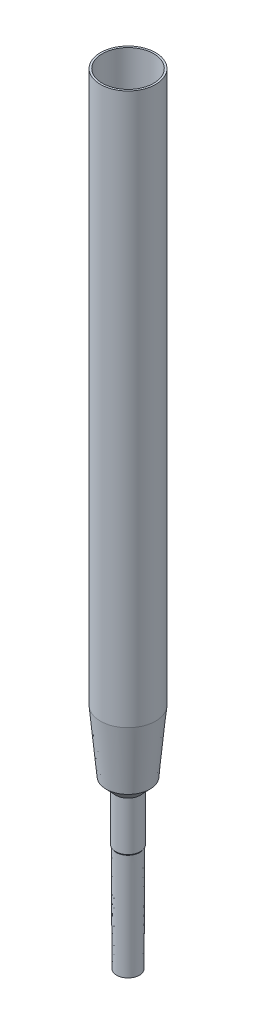
ISO-10303-21;
HEADER;
FILE_DESCRIPTION(('STEP AP214'),'2;1');
FILE_NAME('part.step','',(''),(''),'','','');
FILE_SCHEMA(('AUTOMOTIVE_DESIGN { 1 0 10303 214 1 1 1 1 }'));
ENDSEC;
DATA;
#1=APPLICATION_CONTEXT('core data for automotive mechanical design processes');
#2=APPLICATION_PROTOCOL_DEFINITION('international standard','automotive_design',2000,#1);
#3=PRODUCT_CONTEXT('',#1,'mechanical');
#4=PRODUCT('Part','Part','',(#3));
#5=PRODUCT_RELATED_PRODUCT_CATEGORY('part','',(#4));
#6=PRODUCT_DEFINITION_FORMATION('','',#4);
#7=PRODUCT_DEFINITION_CONTEXT('part definition',#1,'design');
#8=PRODUCT_DEFINITION('design','',#6,#7);
#9=PRODUCT_DEFINITION_SHAPE('','',#8);
#10=(LENGTH_UNIT() NAMED_UNIT(*) SI_UNIT(.MILLI.,.METRE.));
#11=(NAMED_UNIT(*) PLANE_ANGLE_UNIT() SI_UNIT($,.RADIAN.));
#12=(NAMED_UNIT(*) SI_UNIT($,.STERADIAN.) SOLID_ANGLE_UNIT());
#13=UNCERTAINTY_MEASURE_WITH_UNIT(LENGTH_MEASURE(1.E-05),#10,'distance_accuracy_value','');
#14=(GEOMETRIC_REPRESENTATION_CONTEXT(3) GLOBAL_UNCERTAINTY_ASSIGNED_CONTEXT((#13)) GLOBAL_UNIT_ASSIGNED_CONTEXT((#10,
#11,#12)) REPRESENTATION_CONTEXT('',''));
#15=CARTESIAN_POINT('',(0.,0.,0.));
#16=DIRECTION('',(0.,0.,1.));
#17=DIRECTION('',(1.,0.,0.));
#18=AXIS2_PLACEMENT_3D('',#15,#16,#17);
#19=CARTESIAN_POINT('',(0.,16.3999999975087,0.));
#20=DIRECTION('',(0.,1.,0.));
#21=DIRECTION('',(0.,0.,1.));
#22=AXIS2_PLACEMENT_3D('',#19,#20,#21);
#23=CONICAL_SURFACE('',#22,1.25,0.00304877104211893);
#24=CARTESIAN_POINT('',(0.,-3.87927537315313E-13,0.));
#25=DIRECTION('',(0.,-1.,0.));
#26=DIRECTION('',(0.,0.,-1.));
#27=AXIS2_PLACEMENT_3D('',#24,#25,#26);
#28=CIRCLE('',#27,1.2);
#29=CARTESIAN_POINT('',(0.,-3.87927537315313E-13,-1.2));
#30=VERTEX_POINT('',#29);
#31=EDGE_CURVE('E41',#30,#30,#28,.T.);
#32=ORIENTED_EDGE('',*,*,#31,.F.);
#33=EDGE_LOOP('',(#32));
#34=FACE_BOUND('',#33,.T.);
#35=CARTESIAN_POINT('',(0.,11.1999999999996,0.));
#36=DIRECTION('',(0.,1.,0.));
#37=DIRECTION('',(0.,0.,1.));
#38=AXIS2_PLACEMENT_3D('',#35,#36,#37);
#39=CIRCLE('',#38,1.2341463414686);
#40=CARTESIAN_POINT('',(0.,11.1999999999996,1.2341463414686));
#41=VERTEX_POINT('',#40);
#42=EDGE_CURVE('E10',#41,#41,#39,.T.);
#43=ORIENTED_EDGE('',*,*,#42,.F.);
#44=EDGE_LOOP('',(#43));
#45=FACE_BOUND('',#44,.T.);
#46=ADVANCED_FACE('F31',(#34,#45),#23,.T.);
#47=CARTESIAN_POINT('',(0.,17.5,0.));
#48=DIRECTION('',(0.,1.,0.));
#49=DIRECTION('',(0.,0.,1.));
#50=AXIS2_PLACEMENT_3D('',#47,#48,#49);
#51=CONICAL_SURFACE('',#50,2.30000000000089,0.762146539456237);
#52=CARTESIAN_POINT('',(0.,17.5,0.));
#53=DIRECTION('',(0.,-1.,0.));
#54=DIRECTION('',(0.,0.,-1.));
#55=AXIS2_PLACEMENT_3D('',#52,#53,#54);
#56=CIRCLE('',#55,2.30000000000089);
#57=CARTESIAN_POINT('',(0.,17.5,-2.30000000000089));
#58=VERTEX_POINT('',#57);
#59=EDGE_CURVE('E68',#58,#58,#56,.T.);
#60=ORIENTED_EDGE('',*,*,#59,.T.);
#61=EDGE_LOOP('',(#60));
#62=FACE_BOUND('',#61,.T.);
#63=CARTESIAN_POINT('',(0.,16.4523809500083,0.));
#64=DIRECTION('',(0.,1.,0.));
#65=DIRECTION('',(0.,0.,1.));
#66=AXIS2_PLACEMENT_3D('',#63,#64,#65);
#67=CIRCLE('',#66,1.3);
#68=CARTESIAN_POINT('',(0.,16.4523809500083,1.3));
#69=VERTEX_POINT('',#68);
#70=EDGE_CURVE('E37',#69,#69,#67,.F.);
#71=ORIENTED_EDGE('',*,*,#70,.F.);
#72=EDGE_LOOP('',(#71));
#73=FACE_BOUND('',#72,.T.);
#74=ADVANCED_FACE('F91',(#62,#73),#51,.T.);
#75=CARTESIAN_POINT('',(-0.999999070495911,-1.93938503253027E-13,0.));
#76=DIRECTION('',(0.,1.,0.));
#77=DIRECTION('',(0.,0.,1.));
#78=AXIS2_PLACEMENT_3D('',#75,#76,#77);
#79=PLANE('',#78);
#80=CARTESIAN_POINT('',(0.,0.,0.));
#81=DIRECTION('',(0.,-1.,0.));
#82=DIRECTION('',(0.,0.,-1.));
#83=AXIS2_PLACEMENT_3D('',#80,#81,#82);
#84=CIRCLE('',#83,0.999999070495911);
#85=CARTESIAN_POINT('',(0.,0.,-0.999999070495911));
#86=VERTEX_POINT('',#85);
#87=EDGE_CURVE('E45',#86,#86,#84,.T.);
#88=ORIENTED_EDGE('',*,*,#87,.F.);
#89=EDGE_LOOP('',(#88));
#90=FACE_BOUND('',#89,.T.);
#91=ORIENTED_EDGE('',*,*,#31,.T.);
#92=EDGE_LOOP('',(#91));
#93=FACE_BOUND('',#92,.T.);
#94=ADVANCED_FACE('F96',(#90,#93),#79,.F.);
#95=CARTESIAN_POINT('',(0.,0.,0.));
#96=DIRECTION('',(0.,1.,0.));
#97=DIRECTION('',(0.,0.,1.));
#98=AXIS2_PLACEMENT_3D('',#95,#96,#97);
#99=CONICAL_SURFACE('',#98,0.999999070495911,0.00304877104211913);
#100=CARTESIAN_POINT('',(0.,16.4803873266286,0.));
#101=DIRECTION('',(0.,-1.,0.));
#102=DIRECTION('',(0.,0.,-1.));
#103=AXIS2_PLACEMENT_3D('',#100,#101,#102);
#104=CIRCLE('',#103,1.05024415381644);
#105=CARTESIAN_POINT('',(0.,16.4803873266286,-1.05024415381644));
#106=VERTEX_POINT('',#105);
#107=EDGE_CURVE('E50',#106,#106,#104,.T.);
#108=ORIENTED_EDGE('',*,*,#107,.F.);
#109=EDGE_LOOP('',(#108));
#110=FACE_BOUND('',#109,.T.);
#111=ORIENTED_EDGE('',*,*,#87,.T.);
#112=EDGE_LOOP('',(#111));
#113=FACE_BOUND('',#112,.T.);
#114=ADVANCED_FACE('F102',(#110,#113),#99,.F.);
#115=CARTESIAN_POINT('',(0.,16.4803873266286,0.));
#116=DIRECTION('',(0.,1.,0.));
#117=DIRECTION('',(0.,0.,1.));
#118=AXIS2_PLACEMENT_3D('',#115,#116,#117);
#119=CONICAL_SURFACE('',#118,1.05024415381644,0.762146539456237);
#120=CARTESIAN_POINT('',(0.,17.5877239962006,0.));
#121=DIRECTION('',(0.,-1.,0.));
#122=DIRECTION('',(0.,0.,-1.));
#123=AXIS2_PLACEMENT_3D('',#120,#121,#122);
#124=CIRCLE('',#123,2.10724733601489);
#125=CARTESIAN_POINT('',(0.,17.5877239962006,-2.10724733601489));
#126=VERTEX_POINT('',#125);
#127=EDGE_CURVE('E53',#126,#126,#124,.T.);
#128=ORIENTED_EDGE('',*,*,#127,.F.);
#129=EDGE_LOOP('',(#128));
#130=FACE_BOUND('',#129,.T.);
#131=ORIENTED_EDGE('',*,*,#107,.T.);
#132=EDGE_LOOP('',(#131));
#133=FACE_BOUND('',#132,.T.);
#134=ADVANCED_FACE('F107',(#130,#133),#119,.F.);
#135=CARTESIAN_POINT('',(0.,17.5877239962006,0.));
#136=DIRECTION('',(0.,1.,0.));
#137=DIRECTION('',(0.,0.,1.));
#138=AXIS2_PLACEMENT_3D('',#135,#136,#137);
#139=CONICAL_SURFACE('',#138,2.10724733601489,0.0920468488632576);
#140=CARTESIAN_POINT('',(0.,24.009211189544,0.));
#141=DIRECTION('',(0.,-1.,0.));
#142=DIRECTION('',(0.,0.,-1.));
#143=AXIS2_PLACEMENT_3D('',#140,#141,#142);
#144=CIRCLE('',#143,2.70000000001486);
#145=CARTESIAN_POINT('',(0.,24.009211189544,-2.70000000001486));
#146=VERTEX_POINT('',#145);
#147=EDGE_CURVE('E56',#146,#146,#144,.T.);
#148=ORIENTED_EDGE('',*,*,#147,.F.);
#149=EDGE_LOOP('',(#148));
#150=FACE_BOUND('',#149,.T.);
#151=ORIENTED_EDGE('',*,*,#127,.T.);
#152=EDGE_LOOP('',(#151));
#153=FACE_BOUND('',#152,.T.);
#154=ADVANCED_FACE('F114',(#150,#153),#139,.F.);
#155=CARTESIAN_POINT('',(0.,0.,0.));
#156=DIRECTION('',(0.,-1.,0.));
#157=DIRECTION('',(0.,0.,-1.));
#158=AXIS2_PLACEMENT_3D('',#155,#156,#157);
#159=CYLINDRICAL_SURFACE('',#158,2.70000000001486);
#160=CARTESIAN_POINT('',(0.,82.,0.));
#161=DIRECTION('',(0.,-1.,0.));
#162=DIRECTION('',(0.,0.,-1.));
#163=AXIS2_PLACEMENT_3D('',#160,#161,#162);
#164=CIRCLE('',#163,2.70000000001486);
#165=CARTESIAN_POINT('',(0.,82.,-2.70000000001486));
#166=VERTEX_POINT('',#165);
#167=EDGE_CURVE('E59',#166,#166,#164,.T.);
#168=ORIENTED_EDGE('',*,*,#167,.F.);
#169=EDGE_LOOP('',(#168));
#170=FACE_BOUND('',#169,.T.);
#171=ORIENTED_EDGE('',*,*,#147,.T.);
#172=EDGE_LOOP('',(#171));
#173=FACE_BOUND('',#172,.T.);
#174=ADVANCED_FACE('F118',(#170,#173),#159,.F.);
#175=CARTESIAN_POINT('',(-2.89999999999991,82.,0.));
#176=DIRECTION('',(0.,-1.,0.));
#177=DIRECTION('',(0.,0.,-1.));
#178=AXIS2_PLACEMENT_3D('',#175,#176,#177);
#179=PLANE('',#178);
#180=CARTESIAN_POINT('',(0.,82.,0.));
#181=DIRECTION('',(0.,-1.,0.));
#182=DIRECTION('',(0.,0.,-1.));
#183=AXIS2_PLACEMENT_3D('',#180,#181,#182);
#184=CIRCLE('',#183,2.89999999999991);
#185=CARTESIAN_POINT('',(0.,82.,-2.89999999999991));
#186=VERTEX_POINT('',#185);
#187=EDGE_CURVE('E62',#186,#186,#184,.T.);
#188=ORIENTED_EDGE('',*,*,#187,.F.);
#189=EDGE_LOOP('',(#188));
#190=FACE_BOUND('',#189,.T.);
#191=ORIENTED_EDGE('',*,*,#167,.T.);
#192=EDGE_LOOP('',(#191));
#193=FACE_BOUND('',#192,.T.);
#194=ADVANCED_FACE('F122',(#190,#193),#179,.F.);
#195=CARTESIAN_POINT('',(0.,0.,0.));
#196=DIRECTION('',(0.,-1.,0.));
#197=DIRECTION('',(0.,0.,-1.));
#198=AXIS2_PLACEMENT_3D('',#195,#196,#197);
#199=CYLINDRICAL_SURFACE('',#198,2.89999999999991);
#200=CARTESIAN_POINT('',(0.,24.,0.));
#201=DIRECTION('',(0.,-1.,0.));
#202=DIRECTION('',(0.,0.,-1.));
#203=AXIS2_PLACEMENT_3D('',#200,#201,#202);
#204=CIRCLE('',#203,2.89999999999991);
#205=CARTESIAN_POINT('',(0.,24.,-2.89999999999991));
#206=VERTEX_POINT('',#205);
#207=EDGE_CURVE('E65',#206,#206,#204,.T.);
#208=ORIENTED_EDGE('',*,*,#207,.F.);
#209=EDGE_LOOP('',(#208));
#210=FACE_BOUND('',#209,.T.);
#211=ORIENTED_EDGE('',*,*,#187,.T.);
#212=EDGE_LOOP('',(#211));
#213=FACE_BOUND('',#212,.T.);
#214=ADVANCED_FACE('F86',(#210,#213),#199,.T.);
#215=CARTESIAN_POINT('',(0.,24.,0.));
#216=DIRECTION('',(0.,1.,0.));
#217=DIRECTION('',(0.,0.,1.));
#218=AXIS2_PLACEMENT_3D('',#215,#216,#217);
#219=CONICAL_SURFACE('',#218,2.89999999999991,0.0920468488632574);
#220=ORIENTED_EDGE('',*,*,#59,.F.);
#221=EDGE_LOOP('',(#220));
#222=FACE_BOUND('',#221,.T.);
#223=ORIENTED_EDGE('',*,*,#207,.T.);
#224=EDGE_LOOP('',(#223));
#225=FACE_BOUND('',#224,.T.);
#226=ADVANCED_FACE('F79',(#222,#225),#219,.T.);
#227=CARTESIAN_POINT('',(0.,0.,0.));
#228=DIRECTION('',(0.,-1.,0.));
#229=DIRECTION('',(0.,0.,-1.));
#230=AXIS2_PLACEMENT_3D('',#227,#228,#229);
#231=CYLINDRICAL_SURFACE('',#230,1.3);
#232=CARTESIAN_POINT('',(0.,11.3140618824403,0.));
#233=DIRECTION('',(0.,-1.,0.));
#234=DIRECTION('',(0.,0.,-1.));
#235=AXIS2_PLACEMENT_3D('',#232,#233,#234);
#236=CIRCLE('',#235,1.3);
#237=CARTESIAN_POINT('',(0.,11.3140618824403,-1.3));
#238=VERTEX_POINT('',#237);
#239=EDGE_CURVE('E71',#238,#238,#236,.T.);
#240=ORIENTED_EDGE('',*,*,#239,.F.);
#241=EDGE_LOOP('',(#240));
#242=FACE_BOUND('',#241,.T.);
#243=ORIENTED_EDGE('',*,*,#70,.T.);
#244=EDGE_LOOP('',(#243));
#245=FACE_BOUND('',#244,.T.);
#246=ADVANCED_FACE('F77',(#242,#245),#231,.T.);
#247=CARTESIAN_POINT('',(0.,11.3140618824403,0.));
#248=DIRECTION('',(0.,1.,0.));
#249=DIRECTION('',(0.,0.,1.));
#250=AXIS2_PLACEMENT_3D('',#247,#248,#249);
#251=CONICAL_SURFACE('',#250,1.3,0.523598775598304);
#252=ORIENTED_EDGE('',*,*,#42,.T.);
#253=EDGE_LOOP('',(#252));
#254=FACE_BOUND('',#253,.T.);
#255=ORIENTED_EDGE('',*,*,#239,.T.);
#256=EDGE_LOOP('',(#255));
#257=FACE_BOUND('',#256,.T.);
#258=ADVANCED_FACE('F75',(#254,#257),#251,.T.);
#259=CLOSED_SHELL('',(#46,#74,#94,#114,#134,#154,#174,#194,#214,#226,#246,#258));
#260=MANIFOLD_SOLID_BREP('B2',#259);
#261=ADVANCED_BREP_SHAPE_REPRESENTATION('',(#18,#260),#14);
#262=SHAPE_DEFINITION_REPRESENTATION(#9,#261);
ENDSEC;
END-ISO-10303-21;
